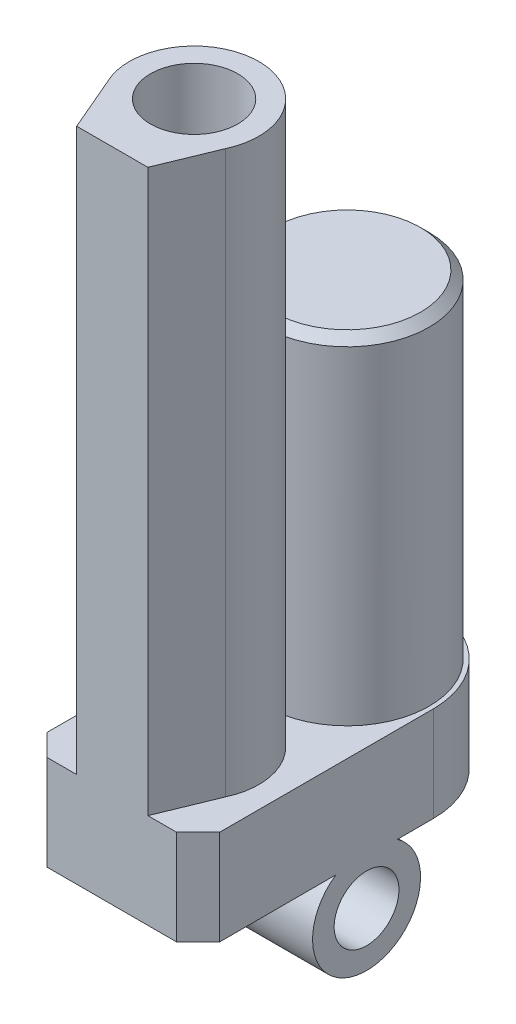
ISO-10303-21;
HEADER;
FILE_DESCRIPTION(('STEP AP214'),'2;1');
FILE_NAME('part.step','',(''),(''),'','','');
FILE_SCHEMA(('AUTOMOTIVE_DESIGN { 1 0 10303 214 1 1 1 1 }'));
ENDSEC;
DATA;
#1=APPLICATION_CONTEXT('core data for automotive mechanical design processes');
#2=APPLICATION_PROTOCOL_DEFINITION('international standard','automotive_design',2000,#1);
#3=PRODUCT_CONTEXT('',#1,'mechanical');
#4=PRODUCT('Part','Part','',(#3));
#5=PRODUCT_RELATED_PRODUCT_CATEGORY('part','',(#4));
#6=PRODUCT_DEFINITION_FORMATION('','',#4);
#7=PRODUCT_DEFINITION_CONTEXT('part definition',#1,'design');
#8=PRODUCT_DEFINITION('design','',#6,#7);
#9=PRODUCT_DEFINITION_SHAPE('','',#8);
#10=(LENGTH_UNIT() NAMED_UNIT(*) SI_UNIT(.MILLI.,.METRE.));
#11=(NAMED_UNIT(*) PLANE_ANGLE_UNIT() SI_UNIT($,.RADIAN.));
#12=(NAMED_UNIT(*) SI_UNIT($,.STERADIAN.) SOLID_ANGLE_UNIT());
#13=UNCERTAINTY_MEASURE_WITH_UNIT(LENGTH_MEASURE(1.E-05),#10,'distance_accuracy_value','');
#14=(GEOMETRIC_REPRESENTATION_CONTEXT(3) GLOBAL_UNCERTAINTY_ASSIGNED_CONTEXT((#13)) GLOBAL_UNIT_ASSIGNED_CONTEXT((#10,
#11,#12)) REPRESENTATION_CONTEXT('',''));
#15=CARTESIAN_POINT('',(0.,0.,0.));
#16=DIRECTION('',(0.,0.,1.));
#17=DIRECTION('',(1.,0.,0.));
#18=AXIS2_PLACEMENT_3D('',#15,#16,#17);
#19=CARTESIAN_POINT('',(0.,6.,0.));
#20=DIRECTION('',(0.,-1.,0.));
#21=DIRECTION('',(0.,0.,-1.));
#22=AXIS2_PLACEMENT_3D('',#19,#20,#21);
#23=PLANE('',#22);
#24=DIRECTION('',(0.,0.,1.));
#25=VECTOR('',#24,1.);
#26=CARTESIAN_POINT('',(-40.,6.,0.));
#27=LINE('',#26,#25);
#28=CARTESIAN_POINT('',(-40.,6.,68.));
#29=VERTEX_POINT('',#28);
#30=CARTESIAN_POINT('',(-40.,6.,14.2623976243478));
#31=VERTEX_POINT('',#30);
#32=EDGE_CURVE('E162',#29,#31,#27,.F.);
#33=ORIENTED_EDGE('',*,*,#32,.T.);
#34=DIRECTION('',(-1.,0.,0.));
#35=VECTOR('',#34,1.);
#36=CARTESIAN_POINT('',(40.,6.,14.2623976243478));
#37=LINE('',#36,#35);
#38=CARTESIAN_POINT('',(40.,6.,14.2623976243478));
#39=VERTEX_POINT('',#38);
#40=EDGE_CURVE('E11',#31,#39,#37,.F.);
#41=ORIENTED_EDGE('',*,*,#40,.T.);
#42=DIRECTION('',(0.,0.,1.));
#43=VECTOR('',#42,1.);
#44=CARTESIAN_POINT('',(40.,6.,0.));
#45=LINE('',#44,#43);
#46=CARTESIAN_POINT('',(40.,5.99999999999999,68.));
#47=VERTEX_POINT('',#46);
#48=EDGE_CURVE('E60',#39,#47,#45,.T.);
#49=ORIENTED_EDGE('',*,*,#48,.T.);
#50=DIRECTION('',(-0.707106781186548,0.,0.707106781186547));
#51=VECTOR('',#50,1.);
#52=CARTESIAN_POINT('',(40.,6.,68.));
#53=LINE('',#52,#51);
#54=CARTESIAN_POINT('',(30.,6.,78.));
#55=VERTEX_POINT('',#54);
#56=EDGE_CURVE('E200',#47,#55,#53,.T.);
#57=ORIENTED_EDGE('',*,*,#56,.T.);
#58=DIRECTION('',(1.,0.,0.));
#59=VECTOR('',#58,1.);
#60=CARTESIAN_POINT('',(0.,6.,78.));
#61=LINE('',#60,#59);
#62=CARTESIAN_POINT('',(-30.,6.,78.));
#63=VERTEX_POINT('',#62);
#64=EDGE_CURVE('E196',#55,#63,#61,.F.);
#65=ORIENTED_EDGE('',*,*,#64,.T.);
#66=DIRECTION('',(-0.707106781186548,0.,-0.707106781186547));
#67=VECTOR('',#66,1.);
#68=CARTESIAN_POINT('',(-30.,6.,78.));
#69=LINE('',#68,#67);
#70=EDGE_CURVE('E184',#63,#29,#69,.T.);
#71=ORIENTED_EDGE('',*,*,#70,.T.);
#72=EDGE_LOOP('',(#33,#41,#49,#57,#65,#71));
#73=FACE_BOUND('',#72,.T.);
#74=ADVANCED_FACE('F37',(#73),#23,.T.);
#75=CARTESIAN_POINT('',(40.,6.,-31.));
#76=VERTEX_POINT('',#75);
#77=CARTESIAN_POINT('',(40.,6.,-14.2623976243478));
#78=VERTEX_POINT('',#77);
#79=EDGE_CURVE('E202',#76,#78,#45,.T.);
#80=ORIENTED_EDGE('',*,*,#79,.T.);
#81=DIRECTION('',(-1.,0.,0.));
#82=VECTOR('',#81,1.);
#83=CARTESIAN_POINT('',(40.,6.,-14.2623976243478));
#84=LINE('',#83,#82);
#85=CARTESIAN_POINT('',(-40.,6.,-14.2623976243478));
#86=VERTEX_POINT('',#85);
#87=EDGE_CURVE('E45',#78,#86,#84,.T.);
#88=ORIENTED_EDGE('',*,*,#87,.T.);
#89=CARTESIAN_POINT('',(-40.,6.,-31.));
#90=VERTEX_POINT('',#89);
#91=EDGE_CURVE('E180',#86,#90,#27,.F.);
#92=ORIENTED_EDGE('',*,*,#91,.T.);
#93=CARTESIAN_POINT('',(0.,6.,-31.));
#94=DIRECTION('',(0.,-1.,0.));
#95=DIRECTION('',(0.,0.,-1.));
#96=AXIS2_PLACEMENT_3D('',#93,#94,#95);
#97=CIRCLE('',#96,40.);
#98=EDGE_CURVE('E159',#90,#76,#97,.T.);
#99=ORIENTED_EDGE('',*,*,#98,.T.);
#100=EDGE_LOOP('',(#80,#88,#92,#99));
#101=FACE_BOUND('',#100,.T.);
#102=ADVANCED_FACE('F300',(#101),#23,.T.);
#103=CARTESIAN_POINT('',(0.,206.,-31.));
#104=DIRECTION('',(0.,1.,0.));
#105=DIRECTION('',(0.,0.,1.));
#106=AXIS2_PLACEMENT_3D('',#103,#104,#105);
#107=PLANE('',#106);
#108=CARTESIAN_POINT('',(0.,206.,-31.));
#109=DIRECTION('',(0.,-1.,0.));
#110=DIRECTION('',(1.,0.,0.));
#111=AXIS2_PLACEMENT_3D('',#108,#109,#110);
#112=CIRCLE('',#111,34.);
#113=CARTESIAN_POINT('',(34.,206.,-31.));
#114=VERTEX_POINT('',#113);
#115=EDGE_CURVE('E176',#114,#114,#112,.T.);
#116=ORIENTED_EDGE('',*,*,#115,.F.);
#117=EDGE_LOOP('',(#116));
#118=FACE_BOUND('',#117,.T.);
#119=ADVANCED_FACE('F39',(#118),#107,.T.);
#120=CARTESIAN_POINT('',(0.,50.,39.8550724637685));
#121=DIRECTION('',(0.,1.,0.));
#122=DIRECTION('',(0.,0.,1.));
#123=AXIS2_PLACEMENT_3D('',#120,#121,#122);
#124=PLANE('',#123);
#125=CARTESIAN_POINT('',(0.,50.,39.8550724637685));
#126=DIRECTION('',(0.,1.,0.));
#127=DIRECTION('',(0.,0.,1.));
#128=AXIS2_PLACEMENT_3D('',#125,#126,#127);
#129=CIRCLE('',#128,20.2);
#130=CARTESIAN_POINT('',(0.,50.,60.0550724637685));
#131=VERTEX_POINT('',#130);
#132=EDGE_CURVE('E158',#131,#131,#129,.T.);
#133=ORIENTED_EDGE('',*,*,#132,.T.);
#134=EDGE_LOOP('',(#133));
#135=FACE_BOUND('',#134,.T.);
#136=ADVANCED_FACE('F466',(#135),#124,.T.);
#137=CARTESIAN_POINT('',(0.,202.,-31.));
#138=DIRECTION('',(0.,-1.,0.));
#139=DIRECTION('',(1.,0.,0.));
#140=AXIS2_PLACEMENT_3D('',#137,#138,#139);
#141=CONICAL_SURFACE('',#140,38.,0.78539816339745);
#142=CARTESIAN_POINT('',(0.,202.,-31.));
#143=DIRECTION('',(0.,-1.,0.));
#144=DIRECTION('',(0.,0.,-1.));
#145=AXIS2_PLACEMENT_3D('',#142,#143,#144);
#146=CIRCLE('',#145,38.);
#147=CARTESIAN_POINT('',(0.,202.,-69.));
#148=VERTEX_POINT('',#147);
#149=EDGE_CURVE('E154',#148,#148,#146,.T.);
#150=ORIENTED_EDGE('',*,*,#149,.F.);
#151=EDGE_LOOP('',(#150));
#152=FACE_BOUND('',#151,.T.);
#153=ORIENTED_EDGE('',*,*,#115,.T.);
#154=EDGE_LOOP('',(#153));
#155=FACE_BOUND('',#154,.T.);
#156=ADVANCED_FACE('F458',(#152,#155),#141,.T.);
#157=CARTESIAN_POINT('',(0.,50.,39.8550724637685));
#158=DIRECTION('',(0.,1.,0.));
#159=DIRECTION('',(0.,0.,1.));
#160=AXIS2_PLACEMENT_3D('',#157,#158,#159);
#161=CYLINDRICAL_SURFACE('',#160,20.2);
#162=CARTESIAN_POINT('',(0.,310.,39.8550724637685));
#163=DIRECTION('',(0.,1.,0.));
#164=DIRECTION('',(0.,0.,1.));
#165=AXIS2_PLACEMENT_3D('',#162,#163,#164);
#166=CIRCLE('',#165,20.2);
#167=CARTESIAN_POINT('',(0.,310.,60.0550724637685));
#168=VERTEX_POINT('',#167);
#169=EDGE_CURVE('E119',#168,#168,#166,.F.);
#170=ORIENTED_EDGE('',*,*,#169,.F.);
#171=EDGE_LOOP('',(#170));
#172=FACE_BOUND('',#171,.T.);
#173=ORIENTED_EDGE('',*,*,#132,.F.);
#174=EDGE_LOOP('',(#173));
#175=FACE_BOUND('',#174,.T.);
#176=ADVANCED_FACE('F449',(#172,#175),#161,.F.);
#177=CARTESIAN_POINT('',(0.,206.,-31.));
#178=DIRECTION('',(0.,-1.,0.));
#179=DIRECTION('',(0.,0.,-1.));
#180=AXIS2_PLACEMENT_3D('',#177,#178,#179);
#181=CYLINDRICAL_SURFACE('',#180,38.);
#182=CARTESIAN_POINT('',(0.,50.,-31.));
#183=DIRECTION('',(0.,-1.,0.));
#184=DIRECTION('',(0.,0.,-1.));
#185=AXIS2_PLACEMENT_3D('',#182,#183,#184);
#186=CIRCLE('',#185,38.);
#187=CARTESIAN_POINT('',(0.,50.,-69.));
#188=VERTEX_POINT('',#187);
#189=EDGE_CURVE('E127',#188,#188,#186,.T.);
#190=ORIENTED_EDGE('',*,*,#189,.F.);
#191=EDGE_LOOP('',(#190));
#192=FACE_BOUND('',#191,.T.);
#193=ORIENTED_EDGE('',*,*,#149,.T.);
#194=EDGE_LOOP('',(#193));
#195=FACE_BOUND('',#194,.T.);
#196=ADVANCED_FACE('F441',(#192,#195),#181,.T.);
#197=CARTESIAN_POINT('',(0.,310.,39.8550724637685));
#198=DIRECTION('',(0.,-1.,0.));
#199=DIRECTION('',(0.,0.,-1.));
#200=AXIS2_PLACEMENT_3D('',#197,#198,#199);
#201=CYLINDRICAL_SURFACE('',#200,30.);
#202=CARTESIAN_POINT('',(0.,50.,39.8550724637685));
#203=DIRECTION('',(0.,-1.,0.));
#204=DIRECTION('',(0.,0.,-1.));
#205=AXIS2_PLACEMENT_3D('',#202,#203,#204);
#206=CIRCLE('',#205,30.);
#207=CARTESIAN_POINT('',(-26.8193026044644,50.,53.298472621845));
#208=VERTEX_POINT('',#207);
#209=CARTESIAN_POINT('',(27.2191613384361,50.,52.4692413239109));
#210=VERTEX_POINT('',#209);
#211=EDGE_CURVE('E167',#208,#210,#206,.T.);
#212=ORIENTED_EDGE('',*,*,#211,.F.);
#213=DIRECTION('',(0.,1.,0.));
#214=VECTOR('',#213,1.);
#215=CARTESIAN_POINT('',(-26.8193026044643,310.,53.2984726218451));
#216=LINE('',#215,#214);
#217=CARTESIAN_POINT('',(-26.8193026044644,310.,53.2984726218451));
#218=VERTEX_POINT('',#217);
#219=EDGE_CURVE('E114',#208,#218,#216,.T.);
#220=ORIENTED_EDGE('',*,*,#219,.T.);
#221=CARTESIAN_POINT('',(0.,310.,39.8550724637685));
#222=DIRECTION('',(0.,-1.,0.));
#223=DIRECTION('',(0.,0.,-1.));
#224=AXIS2_PLACEMENT_3D('',#221,#222,#223);
#225=CIRCLE('',#224,30.);
#226=CARTESIAN_POINT('',(27.2191613384361,310.,52.4692413239109));
#227=VERTEX_POINT('',#226);
#228=EDGE_CURVE('E108',#227,#218,#225,.F.);
#229=ORIENTED_EDGE('',*,*,#228,.F.);
#230=DIRECTION('',(0.,1.,0.));
#231=VECTOR('',#230,1.);
#232=CARTESIAN_POINT('',(27.2191613384361,310.,52.4692413239109));
#233=LINE('',#232,#231);
#234=EDGE_CURVE('E112',#227,#210,#233,.F.);
#235=ORIENTED_EDGE('',*,*,#234,.T.);
#236=EDGE_LOOP('',(#212,#220,#229,#235));
#237=FACE_BOUND('',#236,.T.);
#238=ADVANCED_FACE('F111',(#237),#201,.T.);
#239=CARTESIAN_POINT('',(-16.2267080745342,310.,78.));
#240=DIRECTION('',(0.919061141077471,0.,-0.394114981904238));
#241=DIRECTION('',(-0.394114981904238,0.,-0.919061141077471));
#242=AXIS2_PLACEMENT_3D('',#239,#240,#241);
#243=PLANE('',#242);
#244=DIRECTION('',(0.,1.,0.));
#245=VECTOR('',#244,1.);
#246=CARTESIAN_POINT('',(-16.2267080745342,50.,78.));
#247=LINE('',#246,#245);
#248=CARTESIAN_POINT('',(-16.2267080745342,50.,78.));
#249=VERTEX_POINT('',#248);
#250=CARTESIAN_POINT('',(-16.2267080745342,310.,78.));
#251=VERTEX_POINT('',#250);
#252=EDGE_CURVE('E144',#249,#251,#247,.T.);
#253=ORIENTED_EDGE('',*,*,#252,.T.);
#254=DIRECTION('',(0.394114981904238,0.,0.919061141077471));
#255=VECTOR('',#254,1.);
#256=CARTESIAN_POINT('',(-26.8193026044643,310.,53.2984726218451));
#257=LINE('',#256,#255);
#258=EDGE_CURVE('E118',#218,#251,#257,.T.);
#259=ORIENTED_EDGE('',*,*,#258,.F.);
#260=ORIENTED_EDGE('',*,*,#219,.F.);
#261=DIRECTION('',(-0.394114981904238,0.,-0.91906114107747));
#262=VECTOR('',#261,1.);
#263=CARTESIAN_POINT('',(-16.2267080745342,50.,78.));
#264=LINE('',#263,#262);
#265=EDGE_CURVE('E169',#249,#208,#264,.T.);
#266=ORIENTED_EDGE('',*,*,#265,.F.);
#267=EDGE_LOOP('',(#253,#259,#260,#266));
#268=FACE_BOUND('',#267,.T.);
#269=ADVANCED_FACE('F425',(#268),#243,.F.);
#270=CARTESIAN_POINT('',(0.,310.,39.8550724637685));
#271=DIRECTION('',(0.,1.,0.));
#272=DIRECTION('',(0.,0.,1.));
#273=AXIS2_PLACEMENT_3D('',#270,#271,#272);
#274=PLANE('',#273);
#275=ORIENTED_EDGE('',*,*,#228,.T.);
#276=ORIENTED_EDGE('',*,*,#258,.T.);
#277=DIRECTION('',(-1.,0.,0.));
#278=VECTOR('',#277,1.);
#279=CARTESIAN_POINT('',(-30.,310.,78.));
#280=LINE('',#279,#278);
#281=CARTESIAN_POINT('',(16.7317588269558,310.,78.));
#282=VERTEX_POINT('',#281);
#283=EDGE_CURVE('E133',#251,#282,#280,.F.);
#284=ORIENTED_EDGE('',*,*,#283,.T.);
#285=DIRECTION('',(-0.379967066644192,0.,0.925000015278815));
#286=VECTOR('',#285,1.);
#287=CARTESIAN_POINT('',(16.7317588269558,310.,78.));
#288=LINE('',#287,#286);
#289=EDGE_CURVE('E124',#282,#227,#288,.F.);
#290=ORIENTED_EDGE('',*,*,#289,.T.);
#291=EDGE_LOOP('',(#275,#276,#284,#290));
#292=FACE_BOUND('',#291,.T.);
#293=ORIENTED_EDGE('',*,*,#169,.T.);
#294=EDGE_LOOP('',(#293));
#295=FACE_BOUND('',#294,.T.);
#296=ADVANCED_FACE('F130',(#292,#295),#274,.T.);
#297=CARTESIAN_POINT('',(16.7317588269558,310.,78.));
#298=DIRECTION('',(-0.925000015278815,0.,-0.379967066644192));
#299=DIRECTION('',(-0.379967066644192,0.,0.925000015278815));
#300=AXIS2_PLACEMENT_3D('',#297,#298,#299);
#301=PLANE('',#300);
#302=ORIENTED_EDGE('',*,*,#234,.F.);
#303=ORIENTED_EDGE('',*,*,#289,.F.);
#304=DIRECTION('',(0.,1.,0.));
#305=VECTOR('',#304,1.);
#306=CARTESIAN_POINT('',(16.7317588269558,50.,78.));
#307=LINE('',#306,#305);
#308=CARTESIAN_POINT('',(16.7317588269558,50.,78.));
#309=VERTEX_POINT('',#308);
#310=EDGE_CURVE('E143',#282,#309,#307,.F.);
#311=ORIENTED_EDGE('',*,*,#310,.T.);
#312=DIRECTION('',(-0.379967066644192,0.,0.925000015278815));
#313=VECTOR('',#312,1.);
#314=CARTESIAN_POINT('',(27.2191613384361,50.,52.4692413239109));
#315=LINE('',#314,#313);
#316=EDGE_CURVE('E126',#210,#309,#315,.T.);
#317=ORIENTED_EDGE('',*,*,#316,.F.);
#318=EDGE_LOOP('',(#302,#303,#311,#317));
#319=FACE_BOUND('',#318,.T.);
#320=ADVANCED_FACE('F122',(#319),#301,.F.);
#321=CARTESIAN_POINT('',(0.,50.,-31.));
#322=DIRECTION('',(0.,1.,0.));
#323=DIRECTION('',(0.,0.,1.));
#324=AXIS2_PLACEMENT_3D('',#321,#322,#323);
#325=PLANE('',#324);
#326=ORIENTED_EDGE('',*,*,#265,.T.);
#327=ORIENTED_EDGE('',*,*,#211,.T.);
#328=ORIENTED_EDGE('',*,*,#316,.T.);
#329=DIRECTION('',(-1.,0.,0.));
#330=VECTOR('',#329,1.);
#331=CARTESIAN_POINT('',(-30.,50.,78.));
#332=LINE('',#331,#330);
#333=CARTESIAN_POINT('',(30.,50.,78.));
#334=VERTEX_POINT('',#333);
#335=EDGE_CURVE('E246',#309,#334,#332,.F.);
#336=ORIENTED_EDGE('',*,*,#335,.T.);
#337=DIRECTION('',(-0.707106781186548,0.,0.707106781186547));
#338=VECTOR('',#337,1.);
#339=CARTESIAN_POINT('',(40.,50.,68.));
#340=LINE('',#339,#338);
#341=CARTESIAN_POINT('',(40.,50.,68.));
#342=VERTEX_POINT('',#341);
#343=EDGE_CURVE('E197',#334,#342,#340,.F.);
#344=ORIENTED_EDGE('',*,*,#343,.T.);
#345=DIRECTION('',(0.,0.,1.));
#346=VECTOR('',#345,1.);
#347=CARTESIAN_POINT('',(40.,50.,-31.));
#348=LINE('',#347,#346);
#349=CARTESIAN_POINT('',(40.,50.,-31.));
#350=VERTEX_POINT('',#349);
#351=EDGE_CURVE('E165',#342,#350,#348,.F.);
#352=ORIENTED_EDGE('',*,*,#351,.T.);
#353=CARTESIAN_POINT('',(0.,50.,-31.));
#354=DIRECTION('',(0.,-1.,0.));
#355=DIRECTION('',(0.,0.,-1.));
#356=AXIS2_PLACEMENT_3D('',#353,#354,#355);
#357=CIRCLE('',#356,40.);
#358=CARTESIAN_POINT('',(-40.,50.,-31.));
#359=VERTEX_POINT('',#358);
#360=EDGE_CURVE('E163',#359,#350,#357,.T.);
#361=ORIENTED_EDGE('',*,*,#360,.F.);
#362=DIRECTION('',(0.,0.,-1.));
#363=VECTOR('',#362,1.);
#364=CARTESIAN_POINT('',(-40.,50.,-31.));
#365=LINE('',#364,#363);
#366=CARTESIAN_POINT('',(-40.,50.,68.));
#367=VERTEX_POINT('',#366);
#368=EDGE_CURVE('E210',#359,#367,#365,.F.);
#369=ORIENTED_EDGE('',*,*,#368,.T.);
#370=DIRECTION('',(-0.707106781186548,0.,-0.707106781186547));
#371=VECTOR('',#370,1.);
#372=CARTESIAN_POINT('',(-40.,50.,68.));
#373=LINE('',#372,#371);
#374=CARTESIAN_POINT('',(-30.,50.,78.));
#375=VERTEX_POINT('',#374);
#376=EDGE_CURVE('E220',#367,#375,#373,.F.);
#377=ORIENTED_EDGE('',*,*,#376,.T.);
#378=DIRECTION('',(-1.,0.,0.));
#379=VECTOR('',#378,1.);
#380=CARTESIAN_POINT('',(-30.,50.,78.));
#381=LINE('',#380,#379);
#382=EDGE_CURVE('E151',#375,#249,#381,.F.);
#383=ORIENTED_EDGE('',*,*,#382,.T.);
#384=EDGE_LOOP('',(#326,#327,#328,#336,#344,#352,#361,#369,#377,#383));
#385=FACE_BOUND('',#384,.T.);
#386=ORIENTED_EDGE('',*,*,#189,.T.);
#387=EDGE_LOOP('',(#386));
#388=FACE_BOUND('',#387,.T.);
#389=ADVANCED_FACE('F269',(#385,#388),#325,.T.);
#390=CARTESIAN_POINT('',(-30.,50.,78.));
#391=DIRECTION('',(0.,0.,-1.));
#392=DIRECTION('',(-1.,0.,0.));
#393=AXIS2_PLACEMENT_3D('',#390,#391,#392);
#394=PLANE('',#393);
#395=DIRECTION('',(0.,1.,0.));
#396=VECTOR('',#395,1.);
#397=CARTESIAN_POINT('',(30.,50.,78.));
#398=LINE('',#397,#396);
#399=EDGE_CURVE('E193',#55,#334,#398,.T.);
#400=ORIENTED_EDGE('',*,*,#399,.T.);
#401=ORIENTED_EDGE('',*,*,#335,.F.);
#402=ORIENTED_EDGE('',*,*,#310,.F.);
#403=ORIENTED_EDGE('',*,*,#283,.F.);
#404=ORIENTED_EDGE('',*,*,#252,.F.);
#405=ORIENTED_EDGE('',*,*,#382,.F.);
#406=DIRECTION('',(0.,1.,0.));
#407=VECTOR('',#406,1.);
#408=CARTESIAN_POINT('',(-30.,50.,78.));
#409=LINE('',#408,#407);
#410=EDGE_CURVE('E217',#375,#63,#409,.F.);
#411=ORIENTED_EDGE('',*,*,#410,.T.);
#412=ORIENTED_EDGE('',*,*,#64,.F.);
#413=EDGE_LOOP('',(#400,#401,#402,#403,#404,#405,#411,#412));
#414=FACE_BOUND('',#413,.T.);
#415=ADVANCED_FACE('F263',(#414),#394,.F.);
#416=CARTESIAN_POINT('',(-40.,50.,68.));
#417=DIRECTION('',(0.707106781186547,0.,-0.707106781186548));
#418=DIRECTION('',(-0.707106781186548,0.,-0.707106781186547));
#419=AXIS2_PLACEMENT_3D('',#416,#417,#418);
#420=PLANE('',#419);
#421=ORIENTED_EDGE('',*,*,#410,.F.);
#422=ORIENTED_EDGE('',*,*,#376,.F.);
#423=DIRECTION('',(0.,1.,0.));
#424=VECTOR('',#423,1.);
#425=CARTESIAN_POINT('',(-40.,50.,68.));
#426=LINE('',#425,#424);
#427=EDGE_CURVE('E207',#367,#29,#426,.F.);
#428=ORIENTED_EDGE('',*,*,#427,.T.);
#429=ORIENTED_EDGE('',*,*,#70,.F.);
#430=EDGE_LOOP('',(#421,#422,#428,#429));
#431=FACE_BOUND('',#430,.T.);
#432=ADVANCED_FACE('F310',(#431),#420,.F.);
#433=CARTESIAN_POINT('',(-40.,50.,-31.));
#434=DIRECTION('',(1.,0.,0.));
#435=DIRECTION('',(0.,0.,-1.));
#436=AXIS2_PLACEMENT_3D('',#433,#434,#435);
#437=PLANE('',#436);
#438=ORIENTED_EDGE('',*,*,#91,.F.);
#439=CARTESIAN_POINT('',(-40.,-14.5325111470808,0.));
#440=DIRECTION('',(1.,0.,0.));
#441=DIRECTION('',(0.,0.,-1.));
#442=AXIS2_PLACEMENT_3D('',#439,#440,#441);
#443=CIRCLE('',#442,25.);
#444=EDGE_CURVE('E52',#31,#86,#443,.T.);
#445=ORIENTED_EDGE('',*,*,#444,.F.);
#446=ORIENTED_EDGE('',*,*,#32,.F.);
#447=ORIENTED_EDGE('',*,*,#427,.F.);
#448=ORIENTED_EDGE('',*,*,#368,.F.);
#449=DIRECTION('',(0.,-1.,0.));
#450=VECTOR('',#449,1.);
#451=CARTESIAN_POINT('',(-40.,50.,-31.));
#452=LINE('',#451,#450);
#453=EDGE_CURVE('E166',#90,#359,#452,.F.);
#454=ORIENTED_EDGE('',*,*,#453,.F.);
#455=EDGE_LOOP('',(#438,#445,#446,#447,#448,#454));
#456=FACE_BOUND('',#455,.T.);
#457=CARTESIAN_POINT('',(-40.,-14.5325111470808,0.));
#458=DIRECTION('',(1.,0.,0.));
#459=DIRECTION('',(0.,0.,-1.));
#460=AXIS2_PLACEMENT_3D('',#457,#458,#459);
#461=CIRCLE('',#460,15.);
#462=CARTESIAN_POINT('',(-40.,-14.5325111470808,-15.));
#463=VERTEX_POINT('',#462);
#464=EDGE_CURVE('E319',#463,#463,#461,.T.);
#465=ORIENTED_EDGE('',*,*,#464,.T.);
#466=EDGE_LOOP('',(#465));
#467=FACE_BOUND('',#466,.T.);
#468=ADVANCED_FACE('F289',(#456,#467),#437,.F.);
#469=CARTESIAN_POINT('',(0.,50.,-31.));
#470=DIRECTION('',(0.,-1.,0.));
#471=DIRECTION('',(0.,0.,-1.));
#472=AXIS2_PLACEMENT_3D('',#469,#470,#471);
#473=CYLINDRICAL_SURFACE('',#472,40.);
#474=DIRECTION('',(0.,1.,0.));
#475=VECTOR('',#474,1.);
#476=CARTESIAN_POINT('',(40.,50.,-31.));
#477=LINE('',#476,#475);
#478=EDGE_CURVE('E189',#350,#76,#477,.F.);
#479=ORIENTED_EDGE('',*,*,#478,.T.);
#480=ORIENTED_EDGE('',*,*,#98,.F.);
#481=ORIENTED_EDGE('',*,*,#453,.T.);
#482=ORIENTED_EDGE('',*,*,#360,.T.);
#483=EDGE_LOOP('',(#479,#480,#481,#482));
#484=FACE_BOUND('',#483,.T.);
#485=ADVANCED_FACE('F294',(#484),#473,.T.);
#486=CARTESIAN_POINT('',(40.,50.,-31.));
#487=DIRECTION('',(-1.,0.,0.));
#488=DIRECTION('',(0.,0.,1.));
#489=AXIS2_PLACEMENT_3D('',#486,#487,#488);
#490=PLANE('',#489);
#491=ORIENTED_EDGE('',*,*,#48,.F.);
#492=CARTESIAN_POINT('',(40.,-14.5325111470808,0.));
#493=DIRECTION('',(1.,0.,0.));
#494=DIRECTION('',(0.,0.,-1.));
#495=AXIS2_PLACEMENT_3D('',#492,#493,#494);
#496=CIRCLE('',#495,25.);
#497=EDGE_CURVE('E179',#39,#78,#496,.T.);
#498=ORIENTED_EDGE('',*,*,#497,.T.);
#499=ORIENTED_EDGE('',*,*,#79,.F.);
#500=ORIENTED_EDGE('',*,*,#478,.F.);
#501=ORIENTED_EDGE('',*,*,#351,.F.);
#502=DIRECTION('',(0.,1.,0.));
#503=VECTOR('',#502,1.);
#504=CARTESIAN_POINT('',(40.,50.,68.));
#505=LINE('',#504,#503);
#506=EDGE_CURVE('E194',#342,#47,#505,.F.);
#507=ORIENTED_EDGE('',*,*,#506,.T.);
#508=EDGE_LOOP('',(#491,#498,#499,#500,#501,#507));
#509=FACE_BOUND('',#508,.T.);
#510=CARTESIAN_POINT('',(40.,-14.5325111470808,0.));
#511=DIRECTION('',(1.,0.,0.));
#512=DIRECTION('',(0.,0.,-1.));
#513=AXIS2_PLACEMENT_3D('',#510,#511,#512);
#514=CIRCLE('',#513,15.);
#515=CARTESIAN_POINT('',(40.,-14.5325111470808,-15.));
#516=VERTEX_POINT('',#515);
#517=EDGE_CURVE('E316',#516,#516,#514,.T.);
#518=ORIENTED_EDGE('',*,*,#517,.F.);
#519=EDGE_LOOP('',(#518));
#520=FACE_BOUND('',#519,.T.);
#521=ADVANCED_FACE('F277',(#509,#520),#490,.F.);
#522=CARTESIAN_POINT('',(40.,50.,68.));
#523=DIRECTION('',(-0.707106781186547,0.,-0.707106781186548));
#524=DIRECTION('',(-0.707106781186548,0.,0.707106781186547));
#525=AXIS2_PLACEMENT_3D('',#522,#523,#524);
#526=PLANE('',#525);
#527=ORIENTED_EDGE('',*,*,#506,.F.);
#528=ORIENTED_EDGE('',*,*,#343,.F.);
#529=ORIENTED_EDGE('',*,*,#399,.F.);
#530=ORIENTED_EDGE('',*,*,#56,.F.);
#531=EDGE_LOOP('',(#527,#528,#529,#530));
#532=FACE_BOUND('',#531,.T.);
#533=ADVANCED_FACE('F273',(#532),#526,.F.);
#534=CARTESIAN_POINT('',(40.,-14.5325111470808,0.));
#535=DIRECTION('',(-1.,0.,0.));
#536=DIRECTION('',(0.,0.,1.));
#537=AXIS2_PLACEMENT_3D('',#534,#535,#536);
#538=CYLINDRICAL_SURFACE('',#537,25.);
#539=ORIENTED_EDGE('',*,*,#40,.F.);
#540=ORIENTED_EDGE('',*,*,#444,.T.);
#541=ORIENTED_EDGE('',*,*,#87,.F.);
#542=ORIENTED_EDGE('',*,*,#497,.F.);
#543=EDGE_LOOP('',(#539,#540,#541,#542));
#544=FACE_BOUND('',#543,.T.);
#545=ADVANCED_FACE('F314',(#544),#538,.T.);
#546=CARTESIAN_POINT('',(40.,-14.5325111470808,0.));
#547=DIRECTION('',(-1.,0.,0.));
#548=DIRECTION('',(0.,0.,1.));
#549=AXIS2_PLACEMENT_3D('',#546,#547,#548);
#550=CYLINDRICAL_SURFACE('',#549,15.);
#551=ORIENTED_EDGE('',*,*,#517,.T.);
#552=EDGE_LOOP('',(#551));
#553=FACE_BOUND('',#552,.T.);
#554=ORIENTED_EDGE('',*,*,#464,.F.);
#555=EDGE_LOOP('',(#554));
#556=FACE_BOUND('',#555,.T.);
#557=ADVANCED_FACE('F328',(#553,#556),#550,.F.);
#558=CLOSED_SHELL('',(#74,#102,#119,#136,#156,#176,#196,#238,#269,#296,#320,#389,#415,#432,#468,
#485,#521,#533,#545,#557));
#559=MANIFOLD_SOLID_BREP('B2',#558);
#560=ADVANCED_BREP_SHAPE_REPRESENTATION('',(#18,#559),#14);
#561=SHAPE_DEFINITION_REPRESENTATION(#9,#560);
ENDSEC;
END-ISO-10303-21;
